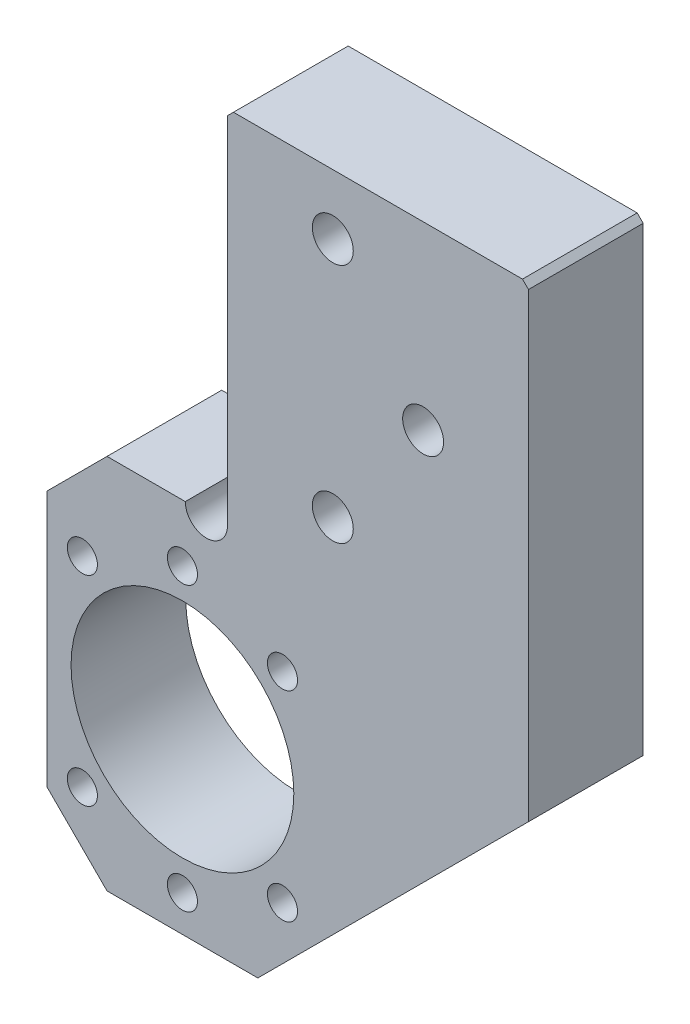
ISO-10303-21;
HEADER;
FILE_DESCRIPTION(('STEP AP214'),'2;1');
FILE_NAME('part.step','',(''),(''),'','','');
FILE_SCHEMA(('AUTOMOTIVE_DESIGN { 1 0 10303 214 1 1 1 1 }'));
ENDSEC;
DATA;
#1=APPLICATION_CONTEXT('core data for automotive mechanical design processes');
#2=APPLICATION_PROTOCOL_DEFINITION('international standard','automotive_design',2000,#1);
#3=PRODUCT_CONTEXT('',#1,'mechanical');
#4=PRODUCT('Part','Part','',(#3));
#5=PRODUCT_RELATED_PRODUCT_CATEGORY('part','',(#4));
#6=PRODUCT_DEFINITION_FORMATION('','',#4);
#7=PRODUCT_DEFINITION_CONTEXT('part definition',#1,'design');
#8=PRODUCT_DEFINITION('design','',#6,#7);
#9=PRODUCT_DEFINITION_SHAPE('','',#8);
#10=(LENGTH_UNIT() NAMED_UNIT(*) SI_UNIT(.MILLI.,.METRE.));
#11=(NAMED_UNIT(*) PLANE_ANGLE_UNIT() SI_UNIT($,.RADIAN.));
#12=(NAMED_UNIT(*) SI_UNIT($,.STERADIAN.) SOLID_ANGLE_UNIT());
#13=UNCERTAINTY_MEASURE_WITH_UNIT(LENGTH_MEASURE(1.E-05),#10,'distance_accuracy_value','');
#14=(GEOMETRIC_REPRESENTATION_CONTEXT(3) GLOBAL_UNCERTAINTY_ASSIGNED_CONTEXT((#13)) GLOBAL_UNIT_ASSIGNED_CONTEXT((#10,
#11,#12)) REPRESENTATION_CONTEXT('',''));
#15=CARTESIAN_POINT('',(0.,0.,0.));
#16=DIRECTION('',(0.,0.,1.));
#17=DIRECTION('',(1.,0.,0.));
#18=AXIS2_PLACEMENT_3D('',#15,#16,#17);
#19=CARTESIAN_POINT('',(3.97499999999999,33.,9.525));
#20=DIRECTION('',(0.,0.,-1.));
#21=DIRECTION('',(-1.,0.,0.));
#22=AXIS2_PLACEMENT_3D('',#19,#20,#21);
#23=PLANE('',#22);
#24=DIRECTION('',(-1.,0.,0.));
#25=VECTOR('',#24,1.);
#26=CARTESIAN_POINT('',(57.475,93.,9.525));
#27=LINE('',#26,#25);
#28=CARTESIAN_POINT('',(56.475,93.,9.525));
#29=VERTEX_POINT('',#28);
#30=CARTESIAN_POINT('',(8.47499999999998,93.,9.525));
#31=VERTEX_POINT('',#30);
#32=EDGE_CURVE('E175',#29,#31,#27,.T.);
#33=ORIENTED_EDGE('',*,*,#32,.T.);
#34=DIRECTION('',(0.707106781186548,0.707106781186548,0.));
#35=VECTOR('',#34,1.);
#36=CARTESIAN_POINT('',(7.47499999999998,92.,9.525));
#37=LINE('',#36,#35);
#38=CARTESIAN_POINT('',(7.47499999999998,92.,9.525));
#39=VERTEX_POINT('',#38);
#40=EDGE_CURVE('E49',#31,#39,#37,.F.);
#41=ORIENTED_EDGE('',*,*,#40,.T.);
#42=DIRECTION('',(0.,-1.,0.));
#43=VECTOR('',#42,1.);
#44=CARTESIAN_POINT('',(7.47499999999998,93.,9.525));
#45=LINE('',#44,#43);
#46=CARTESIAN_POINT('',(7.47499999999999,33.,9.525));
#47=VERTEX_POINT('',#46);
#48=EDGE_CURVE('E148',#39,#47,#45,.T.);
#49=ORIENTED_EDGE('',*,*,#48,.T.);
#50=CARTESIAN_POINT('',(3.97499999999999,33.,9.525));
#51=DIRECTION('',(0.,0.,-1.));
#52=DIRECTION('',(-1.,0.,0.));
#53=AXIS2_PLACEMENT_3D('',#50,#51,#52);
#54=CIRCLE('',#53,3.5);
#55=CARTESIAN_POINT('',(0.474999999999991,33.,9.525));
#56=VERTEX_POINT('',#55);
#57=EDGE_CURVE('E143',#47,#56,#54,.T.);
#58=ORIENTED_EDGE('',*,*,#57,.T.);
#59=DIRECTION('',(-1.,0.,0.));
#60=VECTOR('',#59,1.);
#61=CARTESIAN_POINT('',(0.474999999999991,33.,9.525));
#62=LINE('',#61,#60);
#63=CARTESIAN_POINT('',(-12.525,33.,9.525));
#64=VERTEX_POINT('',#63);
#65=EDGE_CURVE('E132',#56,#64,#62,.T.);
#66=ORIENTED_EDGE('',*,*,#65,.T.);
#67=DIRECTION('',(-0.707106781186547,-0.707106781186548,0.));
#68=VECTOR('',#67,1.);
#69=CARTESIAN_POINT('',(-12.525,33.,9.525));
#70=LINE('',#69,#68);
#71=CARTESIAN_POINT('',(-22.525,23.,9.525));
#72=VERTEX_POINT('',#71);
#73=EDGE_CURVE('E142',#64,#72,#70,.T.);
#74=ORIENTED_EDGE('',*,*,#73,.T.);
#75=DIRECTION('',(0.,-1.,0.));
#76=VECTOR('',#75,1.);
#77=CARTESIAN_POINT('',(-22.525,23.,9.525));
#78=LINE('',#77,#76);
#79=CARTESIAN_POINT('',(-22.525,-19.5,9.525));
#80=VERTEX_POINT('',#79);
#81=EDGE_CURVE('E218',#72,#80,#78,.T.);
#82=ORIENTED_EDGE('',*,*,#81,.T.);
#83=DIRECTION('',(0.707106781186547,-0.707106781186548,0.));
#84=VECTOR('',#83,1.);
#85=CARTESIAN_POINT('',(-22.525,-19.5,9.525));
#86=LINE('',#85,#84);
#87=CARTESIAN_POINT('',(-12.525,-29.5,9.525));
#88=VERTEX_POINT('',#87);
#89=EDGE_CURVE('E251',#80,#88,#86,.T.);
#90=ORIENTED_EDGE('',*,*,#89,.T.);
#91=DIRECTION('',(1.,0.,0.));
#92=VECTOR('',#91,1.);
#93=CARTESIAN_POINT('',(-12.525,-29.5,9.525));
#94=LINE('',#93,#92);
#95=CARTESIAN_POINT('',(12.525,-29.5,9.525));
#96=VERTEX_POINT('',#95);
#97=EDGE_CURVE('E255',#88,#96,#94,.T.);
#98=ORIENTED_EDGE('',*,*,#97,.T.);
#99=DIRECTION('',(0.707106781186547,0.707106781186548,0.));
#100=VECTOR('',#99,1.);
#101=CARTESIAN_POINT('',(12.525,-29.5,9.525));
#102=LINE('',#101,#100);
#103=CARTESIAN_POINT('',(57.475,15.45,9.525));
#104=VERTEX_POINT('',#103);
#105=EDGE_CURVE('E244',#96,#104,#102,.T.);
#106=ORIENTED_EDGE('',*,*,#105,.T.);
#107=DIRECTION('',(0.,1.,0.));
#108=VECTOR('',#107,1.);
#109=CARTESIAN_POINT('',(57.475,15.45,9.525));
#110=LINE('',#109,#108);
#111=CARTESIAN_POINT('',(57.475,92.,9.525));
#112=VERTEX_POINT('',#111);
#113=EDGE_CURVE('E240',#104,#112,#110,.T.);
#114=ORIENTED_EDGE('',*,*,#113,.T.);
#115=DIRECTION('',(0.707106781186543,-0.707106781186552,0.));
#116=VECTOR('',#115,1.);
#117=CARTESIAN_POINT('',(56.475,93.,9.525));
#118=LINE('',#117,#116);
#119=EDGE_CURVE('E173',#112,#29,#118,.F.);
#120=ORIENTED_EDGE('',*,*,#119,.T.);
#121=EDGE_LOOP('',(#33,#41,#49,#58,#66,#74,#82,#90,#98,#106,#114,#120));
#122=FACE_BOUND('',#121,.T.);
#123=CARTESIAN_POINT('',(0.,0.,9.525));
#124=DIRECTION('',(0.,0.,1.));
#125=DIRECTION('',(1.,0.,0.));
#126=AXIS2_PLACEMENT_3D('',#123,#124,#125);
#127=CIRCLE('',#126,18.5);
#128=CARTESIAN_POINT('',(-18.5,0.,9.525));
#129=VERTEX_POINT('',#128);
#130=EDGE_CURVE('E248',#129,#129,#127,.T.);
#131=ORIENTED_EDGE('',*,*,#130,.F.);
#132=EDGE_LOOP('',(#131));
#133=FACE_BOUND('',#132,.T.);
#134=CARTESIAN_POINT('',(24.975,83.,9.525));
#135=DIRECTION('',(0.,0.,1.));
#136=DIRECTION('',(1.,0.,0.));
#137=AXIS2_PLACEMENT_3D('',#134,#135,#136);
#138=CIRCLE('',#137,3.4);
#139=CARTESIAN_POINT('',(28.375,83.,9.525));
#140=VERTEX_POINT('',#139);
#141=EDGE_CURVE('E603',#140,#140,#138,.T.);
#142=ORIENTED_EDGE('',*,*,#141,.F.);
#143=EDGE_LOOP('',(#142));
#144=FACE_BOUND('',#143,.T.);
#145=CARTESIAN_POINT('',(39.975,63.,9.525));
#146=DIRECTION('',(0.,0.,1.));
#147=DIRECTION('',(1.,0.,0.));
#148=AXIS2_PLACEMENT_3D('',#145,#146,#147);
#149=CIRCLE('',#148,3.4);
#150=CARTESIAN_POINT('',(43.375,63.,9.525));
#151=VERTEX_POINT('',#150);
#152=EDGE_CURVE('E597',#151,#151,#149,.T.);
#153=ORIENTED_EDGE('',*,*,#152,.F.);
#154=EDGE_LOOP('',(#153));
#155=FACE_BOUND('',#154,.T.);
#156=CARTESIAN_POINT('',(24.975,43.,9.525));
#157=DIRECTION('',(0.,0.,1.));
#158=DIRECTION('',(1.,0.,0.));
#159=AXIS2_PLACEMENT_3D('',#156,#157,#158);
#160=CIRCLE('',#159,3.4);
#161=CARTESIAN_POINT('',(28.375,43.,9.525));
#162=VERTEX_POINT('',#161);
#163=EDGE_CURVE('E591',#162,#162,#160,.T.);
#164=ORIENTED_EDGE('',*,*,#163,.F.);
#165=EDGE_LOOP('',(#164));
#166=FACE_BOUND('',#165,.T.);
#167=CARTESIAN_POINT('',(-16.6170093578839,-16.6170093578839,9.525));
#168=DIRECTION('',(0.,0.,1.));
#169=DIRECTION('',(1.,0.,0.));
#170=AXIS2_PLACEMENT_3D('',#167,#168,#169);
#171=CIRCLE('',#170,2.5);
#172=CARTESIAN_POINT('',(-14.1170093578839,-16.6170093578839,9.525));
#173=VERTEX_POINT('',#172);
#174=EDGE_CURVE('E585',#173,#173,#171,.T.);
#175=ORIENTED_EDGE('',*,*,#174,.F.);
#176=EDGE_LOOP('',(#175));
#177=FACE_BOUND('',#176,.T.);
#178=CARTESIAN_POINT('',(0.,-23.5,9.525));
#179=DIRECTION('',(0.,0.,1.));
#180=DIRECTION('',(1.,0.,0.));
#181=AXIS2_PLACEMENT_3D('',#178,#179,#180);
#182=CIRCLE('',#181,2.5);
#183=CARTESIAN_POINT('',(2.5,-23.5,9.525));
#184=VERTEX_POINT('',#183);
#185=EDGE_CURVE('E579',#184,#184,#182,.T.);
#186=ORIENTED_EDGE('',*,*,#185,.F.);
#187=EDGE_LOOP('',(#186));
#188=FACE_BOUND('',#187,.T.);
#189=CARTESIAN_POINT('',(16.6170093578839,-16.6170093578839,9.525));
#190=DIRECTION('',(0.,0.,1.));
#191=DIRECTION('',(1.,0.,0.));
#192=AXIS2_PLACEMENT_3D('',#189,#190,#191);
#193=CIRCLE('',#192,2.5);
#194=CARTESIAN_POINT('',(19.1170093578839,-16.6170093578839,9.525));
#195=VERTEX_POINT('',#194);
#196=EDGE_CURVE('E573',#195,#195,#193,.T.);
#197=ORIENTED_EDGE('',*,*,#196,.F.);
#198=EDGE_LOOP('',(#197));
#199=FACE_BOUND('',#198,.T.);
#200=CARTESIAN_POINT('',(16.6170093578839,16.6170093578839,9.525));
#201=DIRECTION('',(0.,0.,1.));
#202=DIRECTION('',(1.,0.,0.));
#203=AXIS2_PLACEMENT_3D('',#200,#201,#202);
#204=CIRCLE('',#203,2.5);
#205=CARTESIAN_POINT('',(19.1170093578839,16.6170093578839,9.525));
#206=VERTEX_POINT('',#205);
#207=EDGE_CURVE('E567',#206,#206,#204,.T.);
#208=ORIENTED_EDGE('',*,*,#207,.F.);
#209=EDGE_LOOP('',(#208));
#210=FACE_BOUND('',#209,.T.);
#211=CARTESIAN_POINT('',(-16.6170093578839,16.6170093578839,9.525));
#212=DIRECTION('',(0.,0.,1.));
#213=DIRECTION('',(1.,0.,0.));
#214=AXIS2_PLACEMENT_3D('',#211,#212,#213);
#215=CIRCLE('',#214,2.5);
#216=CARTESIAN_POINT('',(-14.1170093578839,16.6170093578839,9.525));
#217=VERTEX_POINT('',#216);
#218=EDGE_CURVE('E558',#217,#217,#215,.T.);
#219=ORIENTED_EDGE('',*,*,#218,.F.);
#220=EDGE_LOOP('',(#219));
#221=FACE_BOUND('',#220,.T.);
#222=CARTESIAN_POINT('',(0.,23.5,9.525));
#223=DIRECTION('',(0.,0.,1.));
#224=DIRECTION('',(1.,0.,0.));
#225=AXIS2_PLACEMENT_3D('',#222,#223,#224);
#226=CIRCLE('',#225,2.5);
#227=CARTESIAN_POINT('',(2.49999999999999,23.5,9.525));
#228=VERTEX_POINT('',#227);
#229=EDGE_CURVE('E554',#228,#228,#226,.T.);
#230=ORIENTED_EDGE('',*,*,#229,.F.);
#231=EDGE_LOOP('',(#230));
#232=FACE_BOUND('',#231,.T.);
#233=ADVANCED_FACE('F40',(#122,#133,#144,#155,#166,#177,#188,#199,#210,#221,#232),#23,.F.);
#234=CARTESIAN_POINT('',(3.97499999999999,33.,-9.525));
#235=DIRECTION('',(0.,0.,-1.));
#236=DIRECTION('',(-1.,0.,0.));
#237=AXIS2_PLACEMENT_3D('',#234,#235,#236);
#238=PLANE('',#237);
#239=CARTESIAN_POINT('',(0.,23.5,-9.525));
#240=DIRECTION('',(0.,0.,-1.));
#241=DIRECTION('',(-1.,0.,0.));
#242=AXIS2_PLACEMENT_3D('',#239,#240,#241);
#243=CIRCLE('',#242,2.5);
#244=CARTESIAN_POINT('',(-2.50000000000001,23.5,-9.525));
#245=VERTEX_POINT('',#244);
#246=EDGE_CURVE('E557',#245,#245,#243,.T.);
#247=ORIENTED_EDGE('',*,*,#246,.F.);
#248=EDGE_LOOP('',(#247));
#249=FACE_BOUND('',#248,.T.);
#250=CARTESIAN_POINT('',(-16.6170093578839,16.6170093578839,-9.525));
#251=DIRECTION('',(0.,0.,-1.));
#252=DIRECTION('',(-1.,0.,0.));
#253=AXIS2_PLACEMENT_3D('',#250,#251,#252);
#254=CIRCLE('',#253,2.5);
#255=CARTESIAN_POINT('',(-19.1170093578839,16.6170093578839,-9.525));
#256=VERTEX_POINT('',#255);
#257=EDGE_CURVE('E561',#256,#256,#254,.T.);
#258=ORIENTED_EDGE('',*,*,#257,.F.);
#259=EDGE_LOOP('',(#258));
#260=FACE_BOUND('',#259,.T.);
#261=CARTESIAN_POINT('',(16.6170093578839,16.6170093578839,-9.525));
#262=DIRECTION('',(0.,0.,-1.));
#263=DIRECTION('',(-1.,0.,0.));
#264=AXIS2_PLACEMENT_3D('',#261,#262,#263);
#265=CIRCLE('',#264,2.5);
#266=CARTESIAN_POINT('',(14.1170093578839,16.6170093578839,-9.525));
#267=VERTEX_POINT('',#266);
#268=EDGE_CURVE('E570',#267,#267,#265,.T.);
#269=ORIENTED_EDGE('',*,*,#268,.F.);
#270=EDGE_LOOP('',(#269));
#271=FACE_BOUND('',#270,.T.);
#272=CARTESIAN_POINT('',(16.6170093578839,-16.6170093578839,-9.525));
#273=DIRECTION('',(0.,0.,-1.));
#274=DIRECTION('',(-1.,0.,0.));
#275=AXIS2_PLACEMENT_3D('',#272,#273,#274);
#276=CIRCLE('',#275,2.5);
#277=CARTESIAN_POINT('',(14.1170093578839,-16.6170093578839,-9.525));
#278=VERTEX_POINT('',#277);
#279=EDGE_CURVE('E576',#278,#278,#276,.T.);
#280=ORIENTED_EDGE('',*,*,#279,.F.);
#281=EDGE_LOOP('',(#280));
#282=FACE_BOUND('',#281,.T.);
#283=CARTESIAN_POINT('',(0.,-23.5,-9.525));
#284=DIRECTION('',(0.,0.,-1.));
#285=DIRECTION('',(-1.,0.,0.));
#286=AXIS2_PLACEMENT_3D('',#283,#284,#285);
#287=CIRCLE('',#286,2.5);
#288=CARTESIAN_POINT('',(-2.5,-23.5,-9.525));
#289=VERTEX_POINT('',#288);
#290=EDGE_CURVE('E582',#289,#289,#287,.T.);
#291=ORIENTED_EDGE('',*,*,#290,.F.);
#292=EDGE_LOOP('',(#291));
#293=FACE_BOUND('',#292,.T.);
#294=CARTESIAN_POINT('',(-16.6170093578839,-16.6170093578839,-9.525));
#295=DIRECTION('',(0.,0.,-1.));
#296=DIRECTION('',(-1.,0.,0.));
#297=AXIS2_PLACEMENT_3D('',#294,#295,#296);
#298=CIRCLE('',#297,2.5);
#299=CARTESIAN_POINT('',(-19.1170093578839,-16.6170093578839,-9.525));
#300=VERTEX_POINT('',#299);
#301=EDGE_CURVE('E588',#300,#300,#298,.T.);
#302=ORIENTED_EDGE('',*,*,#301,.F.);
#303=EDGE_LOOP('',(#302));
#304=FACE_BOUND('',#303,.T.);
#305=CARTESIAN_POINT('',(24.975,43.,-9.525));
#306=DIRECTION('',(0.,0.,-1.));
#307=DIRECTION('',(-1.,0.,0.));
#308=AXIS2_PLACEMENT_3D('',#305,#306,#307);
#309=CIRCLE('',#308,3.4);
#310=CARTESIAN_POINT('',(21.575,43.,-9.525));
#311=VERTEX_POINT('',#310);
#312=EDGE_CURVE('E594',#311,#311,#309,.T.);
#313=ORIENTED_EDGE('',*,*,#312,.F.);
#314=EDGE_LOOP('',(#313));
#315=FACE_BOUND('',#314,.T.);
#316=CARTESIAN_POINT('',(39.975,63.,-9.525));
#317=DIRECTION('',(0.,0.,-1.));
#318=DIRECTION('',(-1.,0.,0.));
#319=AXIS2_PLACEMENT_3D('',#316,#317,#318);
#320=CIRCLE('',#319,3.4);
#321=CARTESIAN_POINT('',(36.575,63.,-9.525));
#322=VERTEX_POINT('',#321);
#323=EDGE_CURVE('E600',#322,#322,#320,.T.);
#324=ORIENTED_EDGE('',*,*,#323,.F.);
#325=EDGE_LOOP('',(#324));
#326=FACE_BOUND('',#325,.T.);
#327=CARTESIAN_POINT('',(24.975,83.,-9.525));
#328=DIRECTION('',(0.,0.,-1.));
#329=DIRECTION('',(-1.,0.,0.));
#330=AXIS2_PLACEMENT_3D('',#327,#328,#329);
#331=CIRCLE('',#330,3.4);
#332=CARTESIAN_POINT('',(21.575,83.,-9.525));
#333=VERTEX_POINT('',#332);
#334=EDGE_CURVE('E606',#333,#333,#331,.T.);
#335=ORIENTED_EDGE('',*,*,#334,.F.);
#336=EDGE_LOOP('',(#335));
#337=FACE_BOUND('',#336,.T.);
#338=DIRECTION('',(0.,-1.,0.));
#339=VECTOR('',#338,1.);
#340=CARTESIAN_POINT('',(7.47499999999998,93.,-9.525));
#341=LINE('',#340,#339);
#342=CARTESIAN_POINT('',(7.47499999999998,92.,-9.525));
#343=VERTEX_POINT('',#342);
#344=CARTESIAN_POINT('',(7.47499999999999,33.,-9.525));
#345=VERTEX_POINT('',#344);
#346=EDGE_CURVE('E152',#343,#345,#341,.T.);
#347=ORIENTED_EDGE('',*,*,#346,.F.);
#348=DIRECTION('',(-0.707106781186548,-0.707106781186548,0.));
#349=VECTOR('',#348,1.);
#350=CARTESIAN_POINT('',(-23.775,60.75,-9.525));
#351=LINE('',#350,#349);
#352=CARTESIAN_POINT('',(8.47499999999998,93.,-9.525));
#353=VERTEX_POINT('',#352);
#354=EDGE_CURVE('E167',#343,#353,#351,.F.);
#355=ORIENTED_EDGE('',*,*,#354,.T.);
#356=DIRECTION('',(-1.,0.,0.));
#357=VECTOR('',#356,1.);
#358=CARTESIAN_POINT('',(57.475,93.,-9.525));
#359=LINE('',#358,#357);
#360=CARTESIAN_POINT('',(56.475,93.,-9.525));
#361=VERTEX_POINT('',#360);
#362=EDGE_CURVE('E188',#361,#353,#359,.T.);
#363=ORIENTED_EDGE('',*,*,#362,.F.);
#364=DIRECTION('',(-0.707106781186543,0.707106781186552,0.));
#365=VECTOR('',#364,1.);
#366=CARTESIAN_POINT('',(60.2250000000004,89.2499999999996,-9.525));
#367=LINE('',#366,#365);
#368=CARTESIAN_POINT('',(57.475,92.,-9.525));
#369=VERTEX_POINT('',#368);
#370=EDGE_CURVE('E160',#361,#369,#367,.F.);
#371=ORIENTED_EDGE('',*,*,#370,.T.);
#372=DIRECTION('',(0.,1.,0.));
#373=VECTOR('',#372,1.);
#374=CARTESIAN_POINT('',(57.475,15.45,-9.525));
#375=LINE('',#374,#373);
#376=CARTESIAN_POINT('',(57.475,15.45,-9.525));
#377=VERTEX_POINT('',#376);
#378=EDGE_CURVE('E191',#377,#369,#375,.T.);
#379=ORIENTED_EDGE('',*,*,#378,.F.);
#380=DIRECTION('',(0.707106781186547,0.707106781186548,0.));
#381=VECTOR('',#380,1.);
#382=CARTESIAN_POINT('',(12.525,-29.5,-9.525));
#383=LINE('',#382,#381);
#384=CARTESIAN_POINT('',(12.525,-29.5,-9.525));
#385=VERTEX_POINT('',#384);
#386=EDGE_CURVE('E194',#385,#377,#383,.T.);
#387=ORIENTED_EDGE('',*,*,#386,.F.);
#388=DIRECTION('',(1.,0.,0.));
#389=VECTOR('',#388,1.);
#390=CARTESIAN_POINT('',(-12.525,-29.5,-9.525));
#391=LINE('',#390,#389);
#392=CARTESIAN_POINT('',(-12.525,-29.5,-9.525));
#393=VERTEX_POINT('',#392);
#394=EDGE_CURVE('E226',#393,#385,#391,.T.);
#395=ORIENTED_EDGE('',*,*,#394,.F.);
#396=DIRECTION('',(0.707106781186547,-0.707106781186548,0.));
#397=VECTOR('',#396,1.);
#398=CARTESIAN_POINT('',(-22.525,-19.5,-9.525));
#399=LINE('',#398,#397);
#400=CARTESIAN_POINT('',(-22.525,-19.5,-9.525));
#401=VERTEX_POINT('',#400);
#402=EDGE_CURVE('E224',#401,#393,#399,.T.);
#403=ORIENTED_EDGE('',*,*,#402,.F.);
#404=DIRECTION('',(0.,-1.,0.));
#405=VECTOR('',#404,1.);
#406=CARTESIAN_POINT('',(-22.525,23.,-9.525));
#407=LINE('',#406,#405);
#408=CARTESIAN_POINT('',(-22.525,23.,-9.525));
#409=VERTEX_POINT('',#408);
#410=EDGE_CURVE('E217',#409,#401,#407,.T.);
#411=ORIENTED_EDGE('',*,*,#410,.F.);
#412=DIRECTION('',(-0.707106781186547,-0.707106781186548,0.));
#413=VECTOR('',#412,1.);
#414=CARTESIAN_POINT('',(-12.525,33.,-9.525));
#415=LINE('',#414,#413);
#416=CARTESIAN_POINT('',(-12.525,33.,-9.525));
#417=VERTEX_POINT('',#416);
#418=EDGE_CURVE('E222',#417,#409,#415,.T.);
#419=ORIENTED_EDGE('',*,*,#418,.F.);
#420=DIRECTION('',(-1.,0.,0.));
#421=VECTOR('',#420,1.);
#422=CARTESIAN_POINT('',(0.474999999999991,33.,-9.525));
#423=LINE('',#422,#421);
#424=CARTESIAN_POINT('',(0.474999999999991,33.,-9.525));
#425=VERTEX_POINT('',#424);
#426=EDGE_CURVE('E228',#425,#417,#423,.T.);
#427=ORIENTED_EDGE('',*,*,#426,.F.);
#428=CARTESIAN_POINT('',(3.97499999999999,33.,-9.525));
#429=DIRECTION('',(0.,0.,-1.));
#430=DIRECTION('',(-1.,0.,0.));
#431=AXIS2_PLACEMENT_3D('',#428,#429,#430);
#432=CIRCLE('',#431,3.5);
#433=EDGE_CURVE('E156',#345,#425,#432,.T.);
#434=ORIENTED_EDGE('',*,*,#433,.F.);
#435=EDGE_LOOP('',(#347,#355,#363,#371,#379,#387,#395,#403,#411,#419,#427,#434));
#436=FACE_BOUND('',#435,.T.);
#437=CARTESIAN_POINT('',(0.,0.,-9.525));
#438=DIRECTION('',(0.,0.,1.));
#439=DIRECTION('',(1.,0.,0.));
#440=AXIS2_PLACEMENT_3D('',#437,#438,#439);
#441=CIRCLE('',#440,18.5);
#442=CARTESIAN_POINT('',(-18.5,0.,-9.525));
#443=VERTEX_POINT('',#442);
#444=EDGE_CURVE('E609',#443,#443,#441,.T.);
#445=ORIENTED_EDGE('',*,*,#444,.T.);
#446=EDGE_LOOP('',(#445));
#447=FACE_BOUND('',#446,.T.);
#448=ADVANCED_FACE('F186',(#249,#260,#271,#282,#293,#304,#315,#326,#337,#436,#447),#238,.T.);
#449=CARTESIAN_POINT('',(3.97499999999999,33.,9.525));
#450=DIRECTION('',(0.,0.,-1.));
#451=DIRECTION('',(-1.,0.,0.));
#452=AXIS2_PLACEMENT_3D('',#449,#450,#451);
#453=CYLINDRICAL_SURFACE('',#452,3.5);
#454=ORIENTED_EDGE('',*,*,#433,.T.);
#455=DIRECTION('',(0.,0.,-1.));
#456=VECTOR('',#455,1.);
#457=CARTESIAN_POINT('',(0.474999999999991,33.,9.525));
#458=LINE('',#457,#456);
#459=EDGE_CURVE('E136',#56,#425,#458,.T.);
#460=ORIENTED_EDGE('',*,*,#459,.F.);
#461=ORIENTED_EDGE('',*,*,#57,.F.);
#462=DIRECTION('',(0.,0.,-1.));
#463=VECTOR('',#462,1.);
#464=CARTESIAN_POINT('',(7.47499999999999,33.,9.525));
#465=LINE('',#464,#463);
#466=EDGE_CURVE('E181',#47,#345,#465,.T.);
#467=ORIENTED_EDGE('',*,*,#466,.T.);
#468=EDGE_LOOP('',(#454,#460,#461,#467));
#469=FACE_BOUND('',#468,.T.);
#470=ADVANCED_FACE('F154',(#469),#453,.F.);
#471=CARTESIAN_POINT('',(0.474999999999991,33.,9.525));
#472=DIRECTION('',(0.,-1.,0.));
#473=DIRECTION('',(0.,0.,-1.));
#474=AXIS2_PLACEMENT_3D('',#471,#472,#473);
#475=PLANE('',#474);
#476=ORIENTED_EDGE('',*,*,#426,.T.);
#477=DIRECTION('',(0.,0.,-1.));
#478=VECTOR('',#477,1.);
#479=CARTESIAN_POINT('',(-12.525,33.,9.525));
#480=LINE('',#479,#478);
#481=EDGE_CURVE('E139',#64,#417,#480,.T.);
#482=ORIENTED_EDGE('',*,*,#481,.F.);
#483=ORIENTED_EDGE('',*,*,#65,.F.);
#484=ORIENTED_EDGE('',*,*,#459,.T.);
#485=EDGE_LOOP('',(#476,#482,#483,#484));
#486=FACE_BOUND('',#485,.T.);
#487=ADVANCED_FACE('F134',(#486),#475,.F.);
#488=CARTESIAN_POINT('',(-12.525,33.,9.525));
#489=DIRECTION('',(0.707106781186548,-0.707106781186547,0.));
#490=DIRECTION('',(0.707106781186547,0.707106781186548,0.));
#491=AXIS2_PLACEMENT_3D('',#488,#489,#490);
#492=PLANE('',#491);
#493=ORIENTED_EDGE('',*,*,#418,.T.);
#494=DIRECTION('',(0.,0.,-1.));
#495=VECTOR('',#494,1.);
#496=CARTESIAN_POINT('',(-22.525,23.,9.525));
#497=LINE('',#496,#495);
#498=EDGE_CURVE('E162',#72,#409,#497,.T.);
#499=ORIENTED_EDGE('',*,*,#498,.F.);
#500=ORIENTED_EDGE('',*,*,#73,.F.);
#501=ORIENTED_EDGE('',*,*,#481,.T.);
#502=EDGE_LOOP('',(#493,#499,#500,#501));
#503=FACE_BOUND('',#502,.T.);
#504=ADVANCED_FACE('F249',(#503),#492,.F.);
#505=CARTESIAN_POINT('',(-22.525,23.,9.525));
#506=DIRECTION('',(1.,0.,0.));
#507=DIRECTION('',(0.,1.,0.));
#508=AXIS2_PLACEMENT_3D('',#505,#506,#507);
#509=PLANE('',#508);
#510=ORIENTED_EDGE('',*,*,#410,.T.);
#511=DIRECTION('',(0.,0.,-1.));
#512=VECTOR('',#511,1.);
#513=CARTESIAN_POINT('',(-22.525,-19.5,9.525));
#514=LINE('',#513,#512);
#515=EDGE_CURVE('E208',#80,#401,#514,.T.);
#516=ORIENTED_EDGE('',*,*,#515,.F.);
#517=ORIENTED_EDGE('',*,*,#81,.F.);
#518=ORIENTED_EDGE('',*,*,#498,.T.);
#519=EDGE_LOOP('',(#510,#516,#517,#518));
#520=FACE_BOUND('',#519,.T.);
#521=ADVANCED_FACE('F215',(#520),#509,.F.);
#522=CARTESIAN_POINT('',(-22.525,-19.5,9.525));
#523=DIRECTION('',(0.707106781186548,0.707106781186547,0.));
#524=DIRECTION('',(-0.707106781186547,0.707106781186548,0.));
#525=AXIS2_PLACEMENT_3D('',#522,#523,#524);
#526=PLANE('',#525);
#527=ORIENTED_EDGE('',*,*,#402,.T.);
#528=DIRECTION('',(0.,0.,-1.));
#529=VECTOR('',#528,1.);
#530=CARTESIAN_POINT('',(-12.525,-29.5,9.525));
#531=LINE('',#530,#529);
#532=EDGE_CURVE('E205',#88,#393,#531,.T.);
#533=ORIENTED_EDGE('',*,*,#532,.F.);
#534=ORIENTED_EDGE('',*,*,#89,.F.);
#535=ORIENTED_EDGE('',*,*,#515,.T.);
#536=EDGE_LOOP('',(#527,#533,#534,#535));
#537=FACE_BOUND('',#536,.T.);
#538=ADVANCED_FACE('F262',(#537),#526,.F.);
#539=CARTESIAN_POINT('',(-12.525,-29.5,9.525));
#540=DIRECTION('',(0.,1.,0.));
#541=DIRECTION('',(0.,0.,1.));
#542=AXIS2_PLACEMENT_3D('',#539,#540,#541);
#543=PLANE('',#542);
#544=ORIENTED_EDGE('',*,*,#394,.T.);
#545=DIRECTION('',(0.,0.,-1.));
#546=VECTOR('',#545,1.);
#547=CARTESIAN_POINT('',(12.525,-29.5,9.525));
#548=LINE('',#547,#546);
#549=EDGE_CURVE('E202',#96,#385,#548,.T.);
#550=ORIENTED_EDGE('',*,*,#549,.F.);
#551=ORIENTED_EDGE('',*,*,#97,.F.);
#552=ORIENTED_EDGE('',*,*,#532,.T.);
#553=EDGE_LOOP('',(#544,#550,#551,#552));
#554=FACE_BOUND('',#553,.T.);
#555=ADVANCED_FACE('F260',(#554),#543,.F.);
#556=CARTESIAN_POINT('',(12.525,-29.5,9.525));
#557=DIRECTION('',(-0.707106781186548,0.707106781186547,0.));
#558=DIRECTION('',(-0.707106781186547,-0.707106781186548,0.));
#559=AXIS2_PLACEMENT_3D('',#556,#557,#558);
#560=PLANE('',#559);
#561=ORIENTED_EDGE('',*,*,#386,.T.);
#562=DIRECTION('',(0.,0.,-1.));
#563=VECTOR('',#562,1.);
#564=CARTESIAN_POINT('',(57.475,15.45,9.525));
#565=LINE('',#564,#563);
#566=EDGE_CURVE('E199',#104,#377,#565,.T.);
#567=ORIENTED_EDGE('',*,*,#566,.F.);
#568=ORIENTED_EDGE('',*,*,#105,.F.);
#569=ORIENTED_EDGE('',*,*,#549,.T.);
#570=EDGE_LOOP('',(#561,#567,#568,#569));
#571=FACE_BOUND('',#570,.T.);
#572=ADVANCED_FACE('F235',(#571),#560,.F.);
#573=CARTESIAN_POINT('',(57.475,15.45,9.525));
#574=DIRECTION('',(-1.,0.,0.));
#575=DIRECTION('',(0.,0.,1.));
#576=AXIS2_PLACEMENT_3D('',#573,#574,#575);
#577=PLANE('',#576);
#578=ORIENTED_EDGE('',*,*,#378,.T.);
#579=DIRECTION('',(0.,0.,1.));
#580=VECTOR('',#579,1.);
#581=CARTESIAN_POINT('',(57.475,92.,9.525));
#582=LINE('',#581,#580);
#583=EDGE_CURVE('E11',#369,#112,#582,.T.);
#584=ORIENTED_EDGE('',*,*,#583,.T.);
#585=ORIENTED_EDGE('',*,*,#113,.F.);
#586=ORIENTED_EDGE('',*,*,#566,.T.);
#587=EDGE_LOOP('',(#578,#584,#585,#586));
#588=FACE_BOUND('',#587,.T.);
#589=ADVANCED_FACE('F239',(#588),#577,.F.);
#590=CARTESIAN_POINT('',(57.475,93.,9.525));
#591=DIRECTION('',(0.,-1.,0.));
#592=DIRECTION('',(0.,0.,-1.));
#593=AXIS2_PLACEMENT_3D('',#590,#591,#592);
#594=PLANE('',#593);
#595=ORIENTED_EDGE('',*,*,#362,.T.);
#596=DIRECTION('',(0.,0.,1.));
#597=VECTOR('',#596,1.);
#598=CARTESIAN_POINT('',(8.47499999999998,93.,9.525));
#599=LINE('',#598,#597);
#600=EDGE_CURVE('E62',#353,#31,#599,.T.);
#601=ORIENTED_EDGE('',*,*,#600,.T.);
#602=ORIENTED_EDGE('',*,*,#32,.F.);
#603=DIRECTION('',(0.,0.,-1.));
#604=VECTOR('',#603,1.);
#605=CARTESIAN_POINT('',(56.475,93.,9.525));
#606=LINE('',#605,#604);
#607=EDGE_CURVE('E169',#29,#361,#606,.T.);
#608=ORIENTED_EDGE('',*,*,#607,.T.);
#609=EDGE_LOOP('',(#595,#601,#602,#608));
#610=FACE_BOUND('',#609,.T.);
#611=ADVANCED_FACE('F189',(#610),#594,.F.);
#612=CARTESIAN_POINT('',(7.47499999999998,93.,9.525));
#613=DIRECTION('',(1.,0.,0.));
#614=DIRECTION('',(0.,1.,0.));
#615=AXIS2_PLACEMENT_3D('',#612,#613,#614);
#616=PLANE('',#615);
#617=ORIENTED_EDGE('',*,*,#48,.F.);
#618=DIRECTION('',(0.,0.,-1.));
#619=VECTOR('',#618,1.);
#620=CARTESIAN_POINT('',(7.47499999999998,92.,9.525));
#621=LINE('',#620,#619);
#622=EDGE_CURVE('E157',#39,#343,#621,.T.);
#623=ORIENTED_EDGE('',*,*,#622,.T.);
#624=ORIENTED_EDGE('',*,*,#346,.T.);
#625=ORIENTED_EDGE('',*,*,#466,.F.);
#626=EDGE_LOOP('',(#617,#623,#624,#625));
#627=FACE_BOUND('',#626,.T.);
#628=ADVANCED_FACE('F179',(#627),#616,.F.);
#629=CARTESIAN_POINT('',(0.,0.,9.525));
#630=DIRECTION('',(0.,0.,-1.));
#631=DIRECTION('',(-1.,0.,0.));
#632=AXIS2_PLACEMENT_3D('',#629,#630,#631);
#633=CYLINDRICAL_SURFACE('',#632,18.5);
#634=CARTESIAN_POINT('',(-18.5,0.,9.525));
#635=CARTESIAN_POINT('',(-18.5,0.,9.3265625));
#636=CARTESIAN_POINT('',(-18.5,0.,9.128125));
#637=CARTESIAN_POINT('',(-18.5,0.,8.73125));
#638=CARTESIAN_POINT('',(-18.5,0.,8.5328125));
#639=CARTESIAN_POINT('',(-18.5,0.,8.1359375));
#640=CARTESIAN_POINT('',(-18.5,0.,7.9375));
#641=CARTESIAN_POINT('',(-18.5,0.,7.540625));
#642=CARTESIAN_POINT('',(-18.5,0.,7.3421875));
#643=CARTESIAN_POINT('',(-18.5,0.,6.9453125));
#644=CARTESIAN_POINT('',(-18.5,0.,6.746875));
#645=CARTESIAN_POINT('',(-18.5,0.,6.35));
#646=CARTESIAN_POINT('',(-18.5,0.,6.1515625));
#647=CARTESIAN_POINT('',(-18.5,0.,5.7546875));
#648=CARTESIAN_POINT('',(-18.5,0.,5.55625));
#649=CARTESIAN_POINT('',(-18.5,0.,5.159375));
#650=CARTESIAN_POINT('',(-18.5,0.,4.9609375));
#651=CARTESIAN_POINT('',(-18.5,0.,4.5640625));
#652=CARTESIAN_POINT('',(-18.5,0.,4.365625));
#653=CARTESIAN_POINT('',(-18.5,0.,3.96875));
#654=CARTESIAN_POINT('',(-18.5,0.,3.7703125));
#655=CARTESIAN_POINT('',(-18.5,0.,3.3734375));
#656=CARTESIAN_POINT('',(-18.5,0.,3.175));
#657=CARTESIAN_POINT('',(-18.5,0.,2.778125));
#658=CARTESIAN_POINT('',(-18.5,0.,2.5796875));
#659=CARTESIAN_POINT('',(-18.5,0.,2.1828125));
#660=CARTESIAN_POINT('',(-18.5,0.,1.984375));
#661=CARTESIAN_POINT('',(-18.5,0.,1.5875));
#662=CARTESIAN_POINT('',(-18.5,0.,1.3890625));
#663=CARTESIAN_POINT('',(-18.5,0.,0.992187499999999));
#664=CARTESIAN_POINT('',(-18.5,0.,0.793749999999999));
#665=CARTESIAN_POINT('',(-18.5,0.,0.396874999999998));
#666=CARTESIAN_POINT('',(-18.5,0.,0.198437499999998));
#667=CARTESIAN_POINT('',(-18.5,0.,-0.198437500000002));
#668=CARTESIAN_POINT('',(-18.5,0.,-0.396875000000002));
#669=CARTESIAN_POINT('',(-18.5,0.,-0.793750000000002));
#670=CARTESIAN_POINT('',(-18.5,0.,-0.992187500000002));
#671=CARTESIAN_POINT('',(-18.5,0.,-1.3890625));
#672=CARTESIAN_POINT('',(-18.5,0.,-1.5875));
#673=CARTESIAN_POINT('',(-18.5,0.,-1.984375));
#674=CARTESIAN_POINT('',(-18.5,0.,-2.1828125));
#675=CARTESIAN_POINT('',(-18.5,0.,-2.5796875));
#676=CARTESIAN_POINT('',(-18.5,0.,-2.778125));
#677=CARTESIAN_POINT('',(-18.5,0.,-3.175));
#678=CARTESIAN_POINT('',(-18.5,0.,-3.3734375));
#679=CARTESIAN_POINT('',(-18.5,0.,-3.7703125));
#680=CARTESIAN_POINT('',(-18.5,0.,-3.96875));
#681=CARTESIAN_POINT('',(-18.5,0.,-4.365625));
#682=CARTESIAN_POINT('',(-18.5,0.,-4.5640625));
#683=CARTESIAN_POINT('',(-18.5,0.,-4.9609375));
#684=CARTESIAN_POINT('',(-18.5,0.,-5.159375));
#685=CARTESIAN_POINT('',(-18.5,0.,-5.55625));
#686=CARTESIAN_POINT('',(-18.5,0.,-5.7546875));
#687=CARTESIAN_POINT('',(-18.5,0.,-6.1515625));
#688=CARTESIAN_POINT('',(-18.5,0.,-6.35));
#689=CARTESIAN_POINT('',(-18.5,0.,-6.746875));
#690=CARTESIAN_POINT('',(-18.5,0.,-6.9453125));
#691=CARTESIAN_POINT('',(-18.5,0.,-7.3421875));
#692=CARTESIAN_POINT('',(-18.5,0.,-7.540625));
#693=CARTESIAN_POINT('',(-18.5,0.,-7.9375));
#694=CARTESIAN_POINT('',(-18.5,0.,-8.1359375));
#695=CARTESIAN_POINT('',(-18.5,0.,-8.5328125));
#696=CARTESIAN_POINT('',(-18.5,0.,-8.73125));
#697=CARTESIAN_POINT('',(-18.5,0.,-9.128125));
#698=CARTESIAN_POINT('',(-18.5,0.,-9.3265625));
#699=CARTESIAN_POINT('',(-18.5,0.,-9.525));
#700=B_SPLINE_CURVE_WITH_KNOTS('',3,(#634,#635,#636,#637,#638,#639,#640,#641,#642,#643,#644,
#645,#646,#647,#648,#649,#650,#651,#652,#653,#654,#655,#656,#657,#658,#659,#660,#661,#662,#663,
#664,#665,#666,#667,#668,#669,#670,#671,#672,#673,#674,#675,#676,#677,#678,#679,#680,#681,#682,
#683,#684,#685,#686,#687,#688,#689,#690,#691,#692,#693,#694,#695,#696,#697,#698,#699),
.UNSPECIFIED.,.F.,.F.,(4,2,2,2,2,2,2,2,2,2,2,2,2,2,2,2,2,2,2,2,2,2,2,2,2,2,2,2,2,2,2,2,4),(0.,
0.595312499999999,1.190625,1.7859375,2.38125,2.9765625,3.571875,4.1671875,4.7625,5.3578125,
5.953125,6.5484375,7.14375,7.7390625,8.334375,8.9296875,9.525,10.1203125,10.715625,11.3109375,
11.90625,12.5015625,13.096875,13.6921875,14.2875,14.8828125,15.478125,16.0734375,16.66875,
17.2640625,17.859375,18.4546875,19.05),.UNSPECIFIED.);
#701=EDGE_CURVE('BSEAM279',#129,#443,#700,.T.);
#702=ORIENTED_EDGE('',*,*,#130,.T.);
#703=ORIENTED_EDGE('',*,*,#444,.F.);
#704=ORIENTED_EDGE('',*,*,#701,.T.);
#705=ORIENTED_EDGE('',*,*,#701,.F.);
#706=EDGE_LOOP('',(#702,#704,#703,#705));
#707=FACE_BOUND('',#706,.T.);
#708=ADVANCED_FACE('F279',(#707),#633,.F.);
#709=CARTESIAN_POINT('',(24.975,83.,9.525));
#710=DIRECTION('',(0.,0.,1.));
#711=DIRECTION('',(1.,0.,0.));
#712=AXIS2_PLACEMENT_3D('',#709,#710,#711);
#713=CYLINDRICAL_SURFACE('',#712,3.4);
#714=ORIENTED_EDGE('',*,*,#141,.T.);
#715=EDGE_LOOP('',(#714));
#716=FACE_BOUND('',#715,.T.);
#717=ORIENTED_EDGE('',*,*,#334,.T.);
#718=EDGE_LOOP('',(#717));
#719=FACE_BOUND('',#718,.T.);
#720=ADVANCED_FACE('F313',(#716,#719),#713,.F.);
#721=CARTESIAN_POINT('',(39.975,63.,9.525));
#722=DIRECTION('',(0.,0.,1.));
#723=DIRECTION('',(1.,0.,0.));
#724=AXIS2_PLACEMENT_3D('',#721,#722,#723);
#725=CYLINDRICAL_SURFACE('',#724,3.4);
#726=ORIENTED_EDGE('',*,*,#152,.T.);
#727=EDGE_LOOP('',(#726));
#728=FACE_BOUND('',#727,.T.);
#729=ORIENTED_EDGE('',*,*,#323,.T.);
#730=EDGE_LOOP('',(#729));
#731=FACE_BOUND('',#730,.T.);
#732=ADVANCED_FACE('F321',(#728,#731),#725,.F.);
#733=CARTESIAN_POINT('',(24.975,43.,9.525));
#734=DIRECTION('',(0.,0.,1.));
#735=DIRECTION('',(1.,0.,0.));
#736=AXIS2_PLACEMENT_3D('',#733,#734,#735);
#737=CYLINDRICAL_SURFACE('',#736,3.4);
#738=ORIENTED_EDGE('',*,*,#163,.T.);
#739=EDGE_LOOP('',(#738));
#740=FACE_BOUND('',#739,.T.);
#741=ORIENTED_EDGE('',*,*,#312,.T.);
#742=EDGE_LOOP('',(#741));
#743=FACE_BOUND('',#742,.T.);
#744=ADVANCED_FACE('F329',(#740,#743),#737,.F.);
#745=CARTESIAN_POINT('',(-16.6170093578839,-16.6170093578839,9.525));
#746=DIRECTION('',(0.,0.,1.));
#747=DIRECTION('',(1.,0.,0.));
#748=AXIS2_PLACEMENT_3D('',#745,#746,#747);
#749=CYLINDRICAL_SURFACE('',#748,2.5);
#750=ORIENTED_EDGE('',*,*,#174,.T.);
#751=EDGE_LOOP('',(#750));
#752=FACE_BOUND('',#751,.T.);
#753=ORIENTED_EDGE('',*,*,#301,.T.);
#754=EDGE_LOOP('',(#753));
#755=FACE_BOUND('',#754,.T.);
#756=ADVANCED_FACE('F337',(#752,#755),#749,.F.);
#757=CARTESIAN_POINT('',(0.,-23.5,9.525));
#758=DIRECTION('',(0.,0.,1.));
#759=DIRECTION('',(1.,0.,0.));
#760=AXIS2_PLACEMENT_3D('',#757,#758,#759);
#761=CYLINDRICAL_SURFACE('',#760,2.5);
#762=ORIENTED_EDGE('',*,*,#185,.T.);
#763=EDGE_LOOP('',(#762));
#764=FACE_BOUND('',#763,.T.);
#765=ORIENTED_EDGE('',*,*,#290,.T.);
#766=EDGE_LOOP('',(#765));
#767=FACE_BOUND('',#766,.T.);
#768=ADVANCED_FACE('F345',(#764,#767),#761,.F.);
#769=CARTESIAN_POINT('',(16.6170093578839,-16.6170093578839,9.525));
#770=DIRECTION('',(0.,0.,1.));
#771=DIRECTION('',(1.,0.,0.));
#772=AXIS2_PLACEMENT_3D('',#769,#770,#771);
#773=CYLINDRICAL_SURFACE('',#772,2.5);
#774=ORIENTED_EDGE('',*,*,#196,.T.);
#775=EDGE_LOOP('',(#774));
#776=FACE_BOUND('',#775,.T.);
#777=ORIENTED_EDGE('',*,*,#279,.T.);
#778=EDGE_LOOP('',(#777));
#779=FACE_BOUND('',#778,.T.);
#780=ADVANCED_FACE('F354',(#776,#779),#773,.F.);
#781=CARTESIAN_POINT('',(16.6170093578839,16.6170093578839,9.525));
#782=DIRECTION('',(0.,0.,1.));
#783=DIRECTION('',(1.,0.,0.));
#784=AXIS2_PLACEMENT_3D('',#781,#782,#783);
#785=CYLINDRICAL_SURFACE('',#784,2.5);
#786=ORIENTED_EDGE('',*,*,#207,.T.);
#787=EDGE_LOOP('',(#786));
#788=FACE_BOUND('',#787,.T.);
#789=ORIENTED_EDGE('',*,*,#268,.T.);
#790=EDGE_LOOP('',(#789));
#791=FACE_BOUND('',#790,.T.);
#792=ADVANCED_FACE('F362',(#788,#791),#785,.F.);
#793=CARTESIAN_POINT('',(-16.6170093578839,16.6170093578839,9.525));
#794=DIRECTION('',(0.,0.,1.));
#795=DIRECTION('',(1.,0.,0.));
#796=AXIS2_PLACEMENT_3D('',#793,#794,#795);
#797=CYLINDRICAL_SURFACE('',#796,2.5);
#798=ORIENTED_EDGE('',*,*,#218,.T.);
#799=EDGE_LOOP('',(#798));
#800=FACE_BOUND('',#799,.T.);
#801=ORIENTED_EDGE('',*,*,#257,.T.);
#802=EDGE_LOOP('',(#801));
#803=FACE_BOUND('',#802,.T.);
#804=ADVANCED_FACE('F370',(#800,#803),#797,.F.);
#805=CARTESIAN_POINT('',(0.,23.5,9.525));
#806=DIRECTION('',(0.,0.,1.));
#807=DIRECTION('',(1.,0.,0.));
#808=AXIS2_PLACEMENT_3D('',#805,#806,#807);
#809=CYLINDRICAL_SURFACE('',#808,2.5);
#810=ORIENTED_EDGE('',*,*,#229,.T.);
#811=EDGE_LOOP('',(#810));
#812=FACE_BOUND('',#811,.T.);
#813=ORIENTED_EDGE('',*,*,#246,.T.);
#814=EDGE_LOOP('',(#813));
#815=FACE_BOUND('',#814,.T.);
#816=ADVANCED_FACE('F378',(#812,#815),#809,.F.);
#817=CARTESIAN_POINT('',(7.47499999999998,92.,9.525));
#818=DIRECTION('',(0.707106781186547,-0.707106781186547,0.));
#819=DIRECTION('',(0.,0.,-1.));
#820=AXIS2_PLACEMENT_3D('',#817,#818,#819);
#821=PLANE('',#820);
#822=ORIENTED_EDGE('',*,*,#40,.F.);
#823=ORIENTED_EDGE('',*,*,#600,.F.);
#824=ORIENTED_EDGE('',*,*,#354,.F.);
#825=ORIENTED_EDGE('',*,*,#622,.F.);
#826=EDGE_LOOP('',(#822,#823,#824,#825));
#827=FACE_BOUND('',#826,.T.);
#828=ADVANCED_FACE('F183',(#827),#821,.F.);
#829=CARTESIAN_POINT('',(56.475,93.,9.525));
#830=DIRECTION('',(-0.707106781186552,-0.707106781186542,0.));
#831=DIRECTION('',(0.,0.,-1.));
#832=AXIS2_PLACEMENT_3D('',#829,#830,#831);
#833=PLANE('',#832);
#834=ORIENTED_EDGE('',*,*,#119,.F.);
#835=ORIENTED_EDGE('',*,*,#583,.F.);
#836=ORIENTED_EDGE('',*,*,#370,.F.);
#837=ORIENTED_EDGE('',*,*,#607,.F.);
#838=EDGE_LOOP('',(#834,#835,#836,#837));
#839=FACE_BOUND('',#838,.T.);
#840=ADVANCED_FACE('F43',(#839),#833,.F.);
#841=CLOSED_SHELL('',(#233,#448,#470,#487,#504,#521,#538,#555,#572,#589,#611,#628,#708,#720,
#732,#744,#756,#768,#780,#792,#804,#816,#828,#840));
#842=MANIFOLD_SOLID_BREP('B2',#841);
#843=ADVANCED_BREP_SHAPE_REPRESENTATION('',(#18,#842),#14);
#844=SHAPE_DEFINITION_REPRESENTATION(#9,#843);
ENDSEC;
END-ISO-10303-21;
